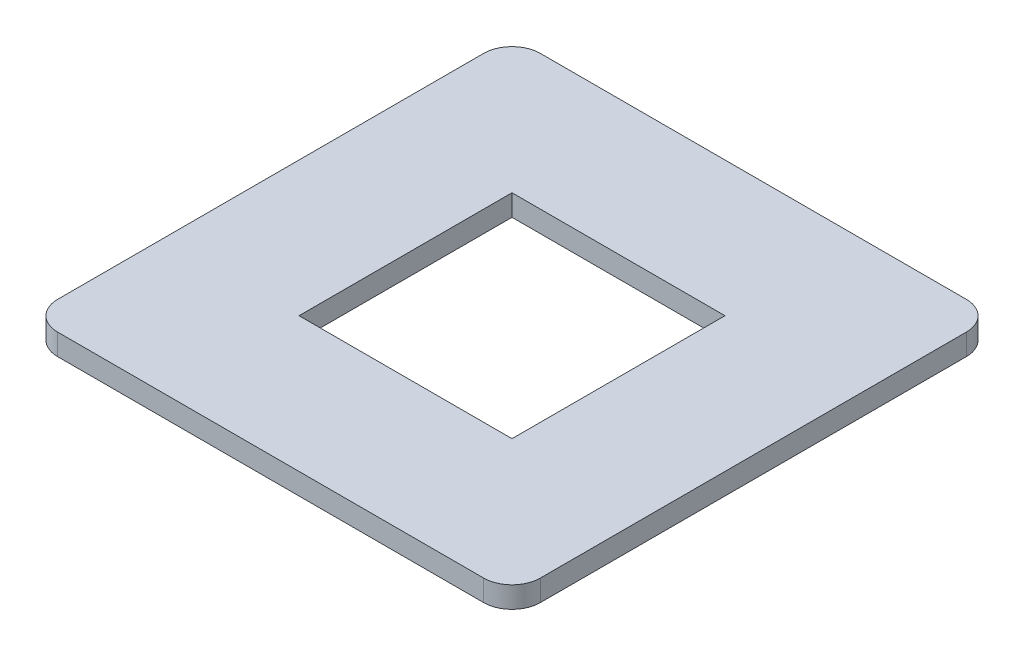
ISO-10303-21;
HEADER;
FILE_DESCRIPTION(('STEP AP214'),'2;1');
FILE_NAME('part.step','',(''),(''),'','','');
FILE_SCHEMA(('AUTOMOTIVE_DESIGN { 1 0 10303 214 1 1 1 1 }'));
ENDSEC;
DATA;
#1=APPLICATION_CONTEXT('core data for automotive mechanical design processes');
#2=APPLICATION_PROTOCOL_DEFINITION('international standard','automotive_design',2000,#1);
#3=PRODUCT_CONTEXT('',#1,'mechanical');
#4=PRODUCT('Part','Part','',(#3));
#5=PRODUCT_RELATED_PRODUCT_CATEGORY('part','',(#4));
#6=PRODUCT_DEFINITION_FORMATION('','',#4);
#7=PRODUCT_DEFINITION_CONTEXT('part definition',#1,'design');
#8=PRODUCT_DEFINITION('design','',#6,#7);
#9=PRODUCT_DEFINITION_SHAPE('','',#8);
#10=(LENGTH_UNIT() NAMED_UNIT(*) SI_UNIT(.MILLI.,.METRE.));
#11=(NAMED_UNIT(*) PLANE_ANGLE_UNIT() SI_UNIT($,.RADIAN.));
#12=(NAMED_UNIT(*) SI_UNIT($,.STERADIAN.) SOLID_ANGLE_UNIT());
#13=UNCERTAINTY_MEASURE_WITH_UNIT(LENGTH_MEASURE(1.E-05),#10,'distance_accuracy_value','');
#14=(GEOMETRIC_REPRESENTATION_CONTEXT(3) GLOBAL_UNCERTAINTY_ASSIGNED_CONTEXT((#13)) GLOBAL_UNIT_ASSIGNED_CONTEXT((#10,
#11,#12)) REPRESENTATION_CONTEXT('',''));
#15=CARTESIAN_POINT('',(0.,0.,0.));
#16=DIRECTION('',(0.,0.,1.));
#17=DIRECTION('',(1.,0.,0.));
#18=AXIS2_PLACEMENT_3D('',#15,#16,#17);
#19=CARTESIAN_POINT('',(85.,7.5,85.));
#20=DIRECTION('',(-1.,0.,0.));
#21=DIRECTION('',(0.,0.,1.));
#22=AXIS2_PLACEMENT_3D('',#19,#20,#21);
#23=PLANE('',#22);
#24=DIRECTION('',(0.,0.,-1.));
#25=VECTOR('',#24,1.);
#26=CARTESIAN_POINT('',(85.,0.,85.));
#27=LINE('',#26,#25);
#28=CARTESIAN_POINT('',(85.,0.,75.));
#29=VERTEX_POINT('',#28);
#30=CARTESIAN_POINT('',(85.,0.,-75.));
#31=VERTEX_POINT('',#30);
#32=EDGE_CURVE('E169',#29,#31,#27,.T.);
#33=ORIENTED_EDGE('',*,*,#32,.T.);
#34=DIRECTION('',(0.,-1.,0.));
#35=VECTOR('',#34,1.);
#36=CARTESIAN_POINT('',(85.,7.5,-75.));
#37=LINE('',#36,#35);
#38=CARTESIAN_POINT('',(85.,7.5,-75.));
#39=VERTEX_POINT('',#38);
#40=EDGE_CURVE('E11',#31,#39,#37,.F.);
#41=ORIENTED_EDGE('',*,*,#40,.T.);
#42=DIRECTION('',(0.,0.,-1.));
#43=VECTOR('',#42,1.);
#44=CARTESIAN_POINT('',(85.,7.5,85.));
#45=LINE('',#44,#43);
#46=CARTESIAN_POINT('',(85.,7.5,75.));
#47=VERTEX_POINT('',#46);
#48=EDGE_CURVE('E170',#47,#39,#45,.T.);
#49=ORIENTED_EDGE('',*,*,#48,.F.);
#50=DIRECTION('',(0.,-1.,0.));
#51=VECTOR('',#50,1.);
#52=CARTESIAN_POINT('',(85.,7.5,75.));
#53=LINE('',#52,#51);
#54=EDGE_CURVE('E47',#47,#29,#53,.T.);
#55=ORIENTED_EDGE('',*,*,#54,.T.);
#56=EDGE_LOOP('',(#33,#41,#49,#55));
#57=FACE_BOUND('',#56,.T.);
#58=ADVANCED_FACE('F39',(#57),#23,.F.);
#59=CARTESIAN_POINT('',(-85.,7.5,-85.));
#60=DIRECTION('',(0.,0.,1.));
#61=DIRECTION('',(1.,0.,0.));
#62=AXIS2_PLACEMENT_3D('',#59,#60,#61);
#63=PLANE('',#62);
#64=DIRECTION('',(-1.,0.,0.));
#65=VECTOR('',#64,1.);
#66=CARTESIAN_POINT('',(-85.,0.,-85.));
#67=LINE('',#66,#65);
#68=CARTESIAN_POINT('',(75.,0.,-85.));
#69=VERTEX_POINT('',#68);
#70=CARTESIAN_POINT('',(-75.,0.,-85.));
#71=VERTEX_POINT('',#70);
#72=EDGE_CURVE('E184',#69,#71,#67,.T.);
#73=ORIENTED_EDGE('',*,*,#72,.T.);
#74=DIRECTION('',(0.,-1.,0.));
#75=VECTOR('',#74,1.);
#76=CARTESIAN_POINT('',(-75.,7.5,-85.));
#77=LINE('',#76,#75);
#78=CARTESIAN_POINT('',(-75.,7.5,-85.));
#79=VERTEX_POINT('',#78);
#80=EDGE_CURVE('E206',#71,#79,#77,.F.);
#81=ORIENTED_EDGE('',*,*,#80,.T.);
#82=DIRECTION('',(-1.,0.,0.));
#83=VECTOR('',#82,1.);
#84=CARTESIAN_POINT('',(-85.,7.5,-85.));
#85=LINE('',#84,#83);
#86=CARTESIAN_POINT('',(75.,7.5,-85.));
#87=VERTEX_POINT('',#86);
#88=EDGE_CURVE('E173',#87,#79,#85,.T.);
#89=ORIENTED_EDGE('',*,*,#88,.F.);
#90=DIRECTION('',(0.,-1.,0.));
#91=VECTOR('',#90,1.);
#92=CARTESIAN_POINT('',(75.,7.5,-85.));
#93=LINE('',#92,#91);
#94=EDGE_CURVE('E203',#87,#69,#93,.T.);
#95=ORIENTED_EDGE('',*,*,#94,.T.);
#96=EDGE_LOOP('',(#73,#81,#89,#95));
#97=FACE_BOUND('',#96,.T.);
#98=ADVANCED_FACE('F235',(#97),#63,.F.);
#99=CARTESIAN_POINT('',(-85.,7.5,85.));
#100=DIRECTION('',(1.,0.,0.));
#101=DIRECTION('',(0.,0.,-1.));
#102=AXIS2_PLACEMENT_3D('',#99,#100,#101);
#103=PLANE('',#102);
#104=DIRECTION('',(0.,0.,1.));
#105=VECTOR('',#104,1.);
#106=CARTESIAN_POINT('',(-85.,7.5,85.));
#107=LINE('',#106,#105);
#108=CARTESIAN_POINT('',(-85.,7.5,-75.));
#109=VERTEX_POINT('',#108);
#110=CARTESIAN_POINT('',(-85.,7.5,75.));
#111=VERTEX_POINT('',#110);
#112=EDGE_CURVE('E177',#109,#111,#107,.T.);
#113=ORIENTED_EDGE('',*,*,#112,.F.);
#114=DIRECTION('',(0.,-1.,0.));
#115=VECTOR('',#114,1.);
#116=CARTESIAN_POINT('',(-85.,7.5,-75.));
#117=LINE('',#116,#115);
#118=CARTESIAN_POINT('',(-85.,0.,-75.));
#119=VERTEX_POINT('',#118);
#120=EDGE_CURVE('E192',#109,#119,#117,.T.);
#121=ORIENTED_EDGE('',*,*,#120,.T.);
#122=DIRECTION('',(0.,0.,1.));
#123=VECTOR('',#122,1.);
#124=CARTESIAN_POINT('',(-85.,0.,85.));
#125=LINE('',#124,#123);
#126=CARTESIAN_POINT('',(-85.,0.,75.));
#127=VERTEX_POINT('',#126);
#128=EDGE_CURVE('E187',#119,#127,#125,.T.);
#129=ORIENTED_EDGE('',*,*,#128,.T.);
#130=DIRECTION('',(0.,-1.,0.));
#131=VECTOR('',#130,1.);
#132=CARTESIAN_POINT('',(-85.,7.5,75.));
#133=LINE('',#132,#131);
#134=EDGE_CURVE('E181',#127,#111,#133,.F.);
#135=ORIENTED_EDGE('',*,*,#134,.T.);
#136=EDGE_LOOP('',(#113,#121,#129,#135));
#137=FACE_BOUND('',#136,.T.);
#138=ADVANCED_FACE('F244',(#137),#103,.F.);
#139=CARTESIAN_POINT('',(-85.,7.5,85.));
#140=DIRECTION('',(0.,0.,-1.));
#141=DIRECTION('',(-1.,0.,0.));
#142=AXIS2_PLACEMENT_3D('',#139,#140,#141);
#143=PLANE('',#142);
#144=DIRECTION('',(1.,0.,0.));
#145=VECTOR('',#144,1.);
#146=CARTESIAN_POINT('',(-85.,7.5,85.));
#147=LINE('',#146,#145);
#148=CARTESIAN_POINT('',(-75.,7.5,85.));
#149=VERTEX_POINT('',#148);
#150=CARTESIAN_POINT('',(75.,7.5,85.));
#151=VERTEX_POINT('',#150);
#152=EDGE_CURVE('E179',#149,#151,#147,.T.);
#153=ORIENTED_EDGE('',*,*,#152,.F.);
#154=DIRECTION('',(0.,-1.,0.));
#155=VECTOR('',#154,1.);
#156=CARTESIAN_POINT('',(-75.,7.5,85.));
#157=LINE('',#156,#155);
#158=CARTESIAN_POINT('',(-75.,0.,85.));
#159=VERTEX_POINT('',#158);
#160=EDGE_CURVE('E216',#149,#159,#157,.T.);
#161=ORIENTED_EDGE('',*,*,#160,.T.);
#162=DIRECTION('',(1.,0.,0.));
#163=VECTOR('',#162,1.);
#164=CARTESIAN_POINT('',(-85.,0.,85.));
#165=LINE('',#164,#163);
#166=CARTESIAN_POINT('',(75.,0.,85.));
#167=VERTEX_POINT('',#166);
#168=EDGE_CURVE('E174',#159,#167,#165,.T.);
#169=ORIENTED_EDGE('',*,*,#168,.T.);
#170=DIRECTION('',(0.,-1.,0.));
#171=VECTOR('',#170,1.);
#172=CARTESIAN_POINT('',(75.,7.5,85.));
#173=LINE('',#172,#171);
#174=EDGE_CURVE('E54',#167,#151,#173,.F.);
#175=ORIENTED_EDGE('',*,*,#174,.T.);
#176=EDGE_LOOP('',(#153,#161,#169,#175));
#177=FACE_BOUND('',#176,.T.);
#178=ADVANCED_FACE('F249',(#177),#143,.F.);
#179=CARTESIAN_POINT('',(0.,7.5,0.));
#180=DIRECTION('',(0.,-1.,0.));
#181=DIRECTION('',(0.,0.,-1.));
#182=AXIS2_PLACEMENT_3D('',#179,#180,#181);
#183=PLANE('',#182);
#184=DIRECTION('',(0.,0.,1.));
#185=VECTOR('',#184,1.);
#186=CARTESIAN_POINT('',(-37.5,7.5,37.5));
#187=LINE('',#186,#185);
#188=CARTESIAN_POINT('',(-37.5,7.5,-37.5));
#189=VERTEX_POINT('',#188);
#190=CARTESIAN_POINT('',(-37.5,7.5,37.5));
#191=VERTEX_POINT('',#190);
#192=EDGE_CURVE('E154',#189,#191,#187,.T.);
#193=ORIENTED_EDGE('',*,*,#192,.F.);
#194=DIRECTION('',(-1.,0.,0.));
#195=VECTOR('',#194,1.);
#196=CARTESIAN_POINT('',(-37.5,7.5,-37.5));
#197=LINE('',#196,#195);
#198=CARTESIAN_POINT('',(37.5,7.5,-37.5));
#199=VERTEX_POINT('',#198);
#200=EDGE_CURVE('E146',#199,#189,#197,.T.);
#201=ORIENTED_EDGE('',*,*,#200,.F.);
#202=DIRECTION('',(0.,0.,-1.));
#203=VECTOR('',#202,1.);
#204=CARTESIAN_POINT('',(37.5,7.5,37.5));
#205=LINE('',#204,#203);
#206=CARTESIAN_POINT('',(37.5,7.5,37.5));
#207=VERTEX_POINT('',#206);
#208=EDGE_CURVE('E158',#207,#199,#205,.T.);
#209=ORIENTED_EDGE('',*,*,#208,.F.);
#210=DIRECTION('',(1.,0.,0.));
#211=VECTOR('',#210,1.);
#212=CARTESIAN_POINT('',(-37.5,7.5,37.5));
#213=LINE('',#212,#211);
#214=EDGE_CURVE('E152',#191,#207,#213,.T.);
#215=ORIENTED_EDGE('',*,*,#214,.F.);
#216=EDGE_LOOP('',(#193,#201,#209,#215));
#217=FACE_BOUND('',#216,.T.);
#218=ORIENTED_EDGE('',*,*,#88,.T.);
#219=CARTESIAN_POINT('',(-75.,7.5,-75.));
#220=DIRECTION('',(0.,-1.,0.));
#221=DIRECTION('',(0.,0.,-1.));
#222=AXIS2_PLACEMENT_3D('',#219,#220,#221);
#223=CIRCLE('',#222,10.);
#224=EDGE_CURVE('E213',#79,#109,#223,.F.);
#225=ORIENTED_EDGE('',*,*,#224,.T.);
#226=ORIENTED_EDGE('',*,*,#112,.T.);
#227=CARTESIAN_POINT('',(-75.,7.5,75.));
#228=DIRECTION('',(0.,-1.,0.));
#229=DIRECTION('',(0.,0.,-1.));
#230=AXIS2_PLACEMENT_3D('',#227,#228,#229);
#231=CIRCLE('',#230,10.);
#232=EDGE_CURVE('E61',#111,#149,#231,.F.);
#233=ORIENTED_EDGE('',*,*,#232,.T.);
#234=ORIENTED_EDGE('',*,*,#152,.T.);
#235=CARTESIAN_POINT('',(75.,7.5,75.));
#236=DIRECTION('',(0.,-1.,0.));
#237=DIRECTION('',(0.,0.,-1.));
#238=AXIS2_PLACEMENT_3D('',#235,#236,#237);
#239=CIRCLE('',#238,10.);
#240=EDGE_CURVE('E208',#151,#47,#239,.F.);
#241=ORIENTED_EDGE('',*,*,#240,.T.);
#242=ORIENTED_EDGE('',*,*,#48,.T.);
#243=CARTESIAN_POINT('',(75.,7.5,-75.));
#244=DIRECTION('',(0.,-1.,0.));
#245=DIRECTION('',(0.,0.,-1.));
#246=AXIS2_PLACEMENT_3D('',#243,#244,#245);
#247=CIRCLE('',#246,10.);
#248=EDGE_CURVE('E210',#39,#87,#247,.F.);
#249=ORIENTED_EDGE('',*,*,#248,.T.);
#250=EDGE_LOOP('',(#218,#225,#226,#233,#234,#241,#242,#249));
#251=FACE_BOUND('',#250,.T.);
#252=ADVANCED_FACE('F238',(#217,#251),#183,.F.);
#253=CARTESIAN_POINT('',(0.,0.,0.));
#254=DIRECTION('',(0.,-1.,0.));
#255=DIRECTION('',(0.,0.,-1.));
#256=AXIS2_PLACEMENT_3D('',#253,#254,#255);
#257=PLANE('',#256);
#258=DIRECTION('',(-1.,0.,0.));
#259=VECTOR('',#258,1.);
#260=CARTESIAN_POINT('',(-37.5,0.,-37.5));
#261=LINE('',#260,#259);
#262=CARTESIAN_POINT('',(37.5,0.,-37.5));
#263=VERTEX_POINT('',#262);
#264=CARTESIAN_POINT('',(-37.5,0.,-37.5));
#265=VERTEX_POINT('',#264);
#266=EDGE_CURVE('E143',#263,#265,#261,.T.);
#267=ORIENTED_EDGE('',*,*,#266,.T.);
#268=DIRECTION('',(0.,0.,1.));
#269=VECTOR('',#268,1.);
#270=CARTESIAN_POINT('',(-37.5,0.,37.5));
#271=LINE('',#270,#269);
#272=CARTESIAN_POINT('',(-37.5,0.,37.5));
#273=VERTEX_POINT('',#272);
#274=EDGE_CURVE('E129',#265,#273,#271,.T.);
#275=ORIENTED_EDGE('',*,*,#274,.T.);
#276=DIRECTION('',(1.,0.,0.));
#277=VECTOR('',#276,1.);
#278=CARTESIAN_POINT('',(-37.5,0.,37.5));
#279=LINE('',#278,#277);
#280=CARTESIAN_POINT('',(37.5,0.,37.5));
#281=VERTEX_POINT('',#280);
#282=EDGE_CURVE('E163',#273,#281,#279,.T.);
#283=ORIENTED_EDGE('',*,*,#282,.T.);
#284=DIRECTION('',(0.,0.,-1.));
#285=VECTOR('',#284,1.);
#286=CARTESIAN_POINT('',(37.5,0.,37.5));
#287=LINE('',#286,#285);
#288=EDGE_CURVE('E151',#281,#263,#287,.T.);
#289=ORIENTED_EDGE('',*,*,#288,.T.);
#290=EDGE_LOOP('',(#267,#275,#283,#289));
#291=FACE_BOUND('',#290,.T.);
#292=ORIENTED_EDGE('',*,*,#128,.F.);
#293=CARTESIAN_POINT('',(-75.,0.,-75.));
#294=DIRECTION('',(0.,-1.,0.));
#295=DIRECTION('',(0.,0.,-1.));
#296=AXIS2_PLACEMENT_3D('',#293,#294,#295);
#297=CIRCLE('',#296,10.);
#298=EDGE_CURVE('E201',#119,#71,#297,.T.);
#299=ORIENTED_EDGE('',*,*,#298,.T.);
#300=ORIENTED_EDGE('',*,*,#72,.F.);
#301=CARTESIAN_POINT('',(75.,0.,-75.));
#302=DIRECTION('',(0.,-1.,0.));
#303=DIRECTION('',(0.,0.,-1.));
#304=AXIS2_PLACEMENT_3D('',#301,#302,#303);
#305=CIRCLE('',#304,10.);
#306=EDGE_CURVE('E197',#69,#31,#305,.T.);
#307=ORIENTED_EDGE('',*,*,#306,.T.);
#308=ORIENTED_EDGE('',*,*,#32,.F.);
#309=CARTESIAN_POINT('',(75.,0.,75.));
#310=DIRECTION('',(0.,-1.,0.));
#311=DIRECTION('',(0.,0.,-1.));
#312=AXIS2_PLACEMENT_3D('',#309,#310,#311);
#313=CIRCLE('',#312,10.);
#314=EDGE_CURVE('E195',#29,#167,#313,.T.);
#315=ORIENTED_EDGE('',*,*,#314,.T.);
#316=ORIENTED_EDGE('',*,*,#168,.F.);
#317=CARTESIAN_POINT('',(-75.,0.,75.));
#318=DIRECTION('',(0.,-1.,0.));
#319=DIRECTION('',(0.,0.,-1.));
#320=AXIS2_PLACEMENT_3D('',#317,#318,#319);
#321=CIRCLE('',#320,10.);
#322=EDGE_CURVE('E199',#159,#127,#321,.T.);
#323=ORIENTED_EDGE('',*,*,#322,.T.);
#324=EDGE_LOOP('',(#292,#299,#300,#307,#308,#315,#316,#323));
#325=FACE_BOUND('',#324,.T.);
#326=ADVANCED_FACE('F149',(#291,#325),#257,.T.);
#327=CARTESIAN_POINT('',(-37.5,-106.066017177982,-37.5));
#328=DIRECTION('',(0.,0.,-1.));
#329=DIRECTION('',(-1.,0.,0.));
#330=AXIS2_PLACEMENT_3D('',#327,#328,#329);
#331=PLANE('',#330);
#332=DIRECTION('',(0.,1.,0.));
#333=VECTOR('',#332,1.);
#334=CARTESIAN_POINT('',(37.5,-106.066017177982,-37.5));
#335=LINE('',#334,#333);
#336=EDGE_CURVE('E161',#263,#199,#335,.T.);
#337=ORIENTED_EDGE('',*,*,#336,.T.);
#338=ORIENTED_EDGE('',*,*,#200,.T.);
#339=DIRECTION('',(0.,1.,0.));
#340=VECTOR('',#339,1.);
#341=CARTESIAN_POINT('',(-37.5,-106.066017177982,-37.5));
#342=LINE('',#341,#340);
#343=EDGE_CURVE('E133',#265,#189,#342,.T.);
#344=ORIENTED_EDGE('',*,*,#343,.F.);
#345=ORIENTED_EDGE('',*,*,#266,.F.);
#346=EDGE_LOOP('',(#337,#338,#344,#345));
#347=FACE_BOUND('',#346,.T.);
#348=ADVANCED_FACE('F142',(#347),#331,.F.);
#349=CARTESIAN_POINT('',(-37.5,-106.066017177982,37.5));
#350=DIRECTION('',(-1.,0.,0.));
#351=DIRECTION('',(0.,0.,1.));
#352=AXIS2_PLACEMENT_3D('',#349,#350,#351);
#353=PLANE('',#352);
#354=ORIENTED_EDGE('',*,*,#343,.T.);
#355=ORIENTED_EDGE('',*,*,#192,.T.);
#356=DIRECTION('',(0.,1.,0.));
#357=VECTOR('',#356,1.);
#358=CARTESIAN_POINT('',(-37.5,-106.066017177982,37.5));
#359=LINE('',#358,#357);
#360=EDGE_CURVE('E135',#273,#191,#359,.T.);
#361=ORIENTED_EDGE('',*,*,#360,.F.);
#362=ORIENTED_EDGE('',*,*,#274,.F.);
#363=EDGE_LOOP('',(#354,#355,#361,#362));
#364=FACE_BOUND('',#363,.T.);
#365=ADVANCED_FACE('F131',(#364),#353,.F.);
#366=CARTESIAN_POINT('',(-37.5,-106.066017177982,37.5));
#367=DIRECTION('',(0.,0.,1.));
#368=DIRECTION('',(1.,0.,0.));
#369=AXIS2_PLACEMENT_3D('',#366,#367,#368);
#370=PLANE('',#369);
#371=ORIENTED_EDGE('',*,*,#360,.T.);
#372=ORIENTED_EDGE('',*,*,#214,.T.);
#373=DIRECTION('',(0.,1.,0.));
#374=VECTOR('',#373,1.);
#375=CARTESIAN_POINT('',(37.5,-106.066017177982,37.5));
#376=LINE('',#375,#374);
#377=EDGE_CURVE('E162',#281,#207,#376,.T.);
#378=ORIENTED_EDGE('',*,*,#377,.F.);
#379=ORIENTED_EDGE('',*,*,#282,.F.);
#380=EDGE_LOOP('',(#371,#372,#378,#379));
#381=FACE_BOUND('',#380,.T.);
#382=ADVANCED_FACE('F294',(#381),#370,.F.);
#383=CARTESIAN_POINT('',(37.5,-106.066017177982,37.5));
#384=DIRECTION('',(1.,0.,0.));
#385=DIRECTION('',(0.,0.,-1.));
#386=AXIS2_PLACEMENT_3D('',#383,#384,#385);
#387=PLANE('',#386);
#388=ORIENTED_EDGE('',*,*,#377,.T.);
#389=ORIENTED_EDGE('',*,*,#208,.T.);
#390=ORIENTED_EDGE('',*,*,#336,.F.);
#391=ORIENTED_EDGE('',*,*,#288,.F.);
#392=EDGE_LOOP('',(#388,#389,#390,#391));
#393=FACE_BOUND('',#392,.T.);
#394=ADVANCED_FACE('F265',(#393),#387,.F.);
#395=CARTESIAN_POINT('',(-75.,7.5,-75.));
#396=DIRECTION('',(0.,-1.,0.));
#397=DIRECTION('',(0.,0.,-1.));
#398=AXIS2_PLACEMENT_3D('',#395,#396,#397);
#399=CYLINDRICAL_SURFACE('',#398,10.);
#400=ORIENTED_EDGE('',*,*,#224,.F.);
#401=ORIENTED_EDGE('',*,*,#80,.F.);
#402=ORIENTED_EDGE('',*,*,#298,.F.);
#403=ORIENTED_EDGE('',*,*,#120,.F.);
#404=EDGE_LOOP('',(#400,#401,#402,#403));
#405=FACE_BOUND('',#404,.T.);
#406=ADVANCED_FACE('F242',(#405),#399,.T.);
#407=CARTESIAN_POINT('',(-75.,7.5,75.));
#408=DIRECTION('',(0.,-1.,0.));
#409=DIRECTION('',(0.,0.,-1.));
#410=AXIS2_PLACEMENT_3D('',#407,#408,#409);
#411=CYLINDRICAL_SURFACE('',#410,10.);
#412=ORIENTED_EDGE('',*,*,#232,.F.);
#413=ORIENTED_EDGE('',*,*,#134,.F.);
#414=ORIENTED_EDGE('',*,*,#322,.F.);
#415=ORIENTED_EDGE('',*,*,#160,.F.);
#416=EDGE_LOOP('',(#412,#413,#414,#415));
#417=FACE_BOUND('',#416,.T.);
#418=ADVANCED_FACE('F248',(#417),#411,.T.);
#419=CARTESIAN_POINT('',(75.,7.5,-75.));
#420=DIRECTION('',(0.,-1.,0.));
#421=DIRECTION('',(0.,0.,-1.));
#422=AXIS2_PLACEMENT_3D('',#419,#420,#421);
#423=CYLINDRICAL_SURFACE('',#422,10.);
#424=ORIENTED_EDGE('',*,*,#248,.F.);
#425=ORIENTED_EDGE('',*,*,#40,.F.);
#426=ORIENTED_EDGE('',*,*,#306,.F.);
#427=ORIENTED_EDGE('',*,*,#94,.F.);
#428=EDGE_LOOP('',(#424,#425,#426,#427));
#429=FACE_BOUND('',#428,.T.);
#430=ADVANCED_FACE('F232',(#429),#423,.T.);
#431=CARTESIAN_POINT('',(75.,7.5,75.));
#432=DIRECTION('',(0.,-1.,0.));
#433=DIRECTION('',(0.,0.,-1.));
#434=AXIS2_PLACEMENT_3D('',#431,#432,#433);
#435=CYLINDRICAL_SURFACE('',#434,10.);
#436=ORIENTED_EDGE('',*,*,#240,.F.);
#437=ORIENTED_EDGE('',*,*,#174,.F.);
#438=ORIENTED_EDGE('',*,*,#314,.F.);
#439=ORIENTED_EDGE('',*,*,#54,.F.);
#440=EDGE_LOOP('',(#436,#437,#438,#439));
#441=FACE_BOUND('',#440,.T.);
#442=ADVANCED_FACE('F41',(#441),#435,.T.);
#443=CLOSED_SHELL('',(#58,#98,#138,#178,#252,#326,#348,#365,#382,#394,#406,#418,#430,#442));
#444=MANIFOLD_SOLID_BREP('B2',#443);
#445=ADVANCED_BREP_SHAPE_REPRESENTATION('',(#18,#444),#14);
#446=SHAPE_DEFINITION_REPRESENTATION(#9,#445);
ENDSEC;
END-ISO-10303-21;
